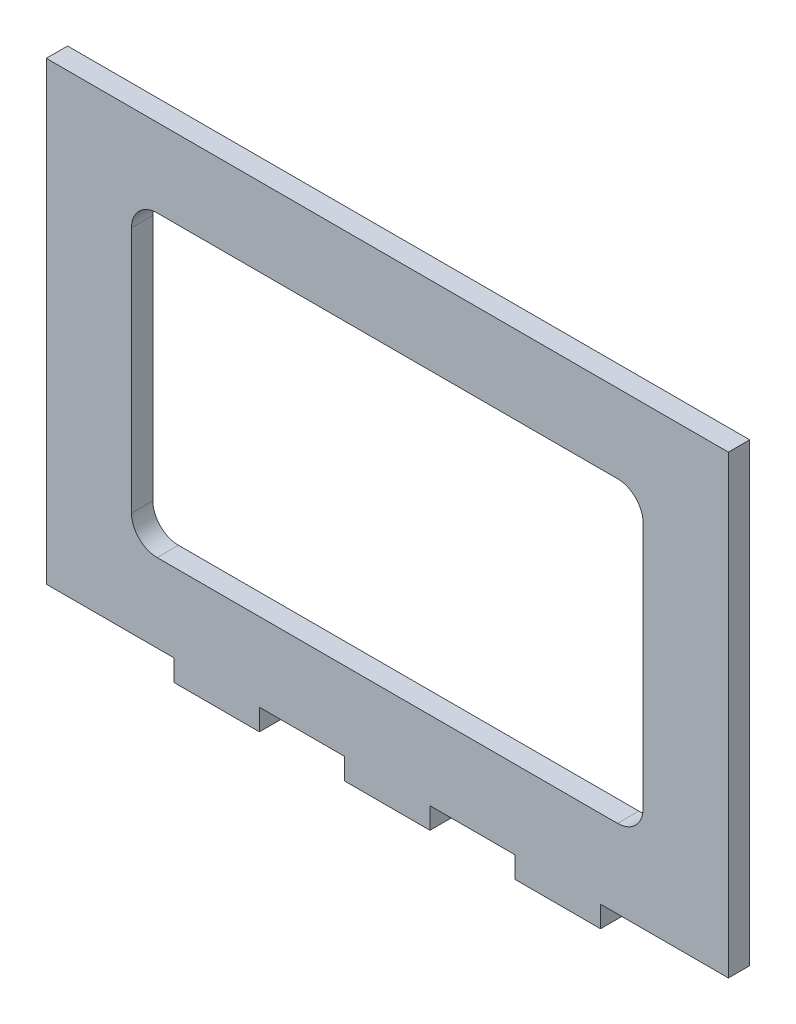
ISO-10303-21;
HEADER;
FILE_DESCRIPTION(('STEP AP214'),'2;1');
FILE_NAME('part.step','',(''),(''),'','','');
FILE_SCHEMA(('AUTOMOTIVE_DESIGN { 1 0 10303 214 1 1 1 1 }'));
ENDSEC;
DATA;
#1=APPLICATION_CONTEXT('core data for automotive mechanical design processes');
#2=APPLICATION_PROTOCOL_DEFINITION('international standard','automotive_design',2000,#1);
#3=PRODUCT_CONTEXT('',#1,'mechanical');
#4=PRODUCT('Part','Part','',(#3));
#5=PRODUCT_RELATED_PRODUCT_CATEGORY('part','',(#4));
#6=PRODUCT_DEFINITION_FORMATION('','',#4);
#7=PRODUCT_DEFINITION_CONTEXT('part definition',#1,'design');
#8=PRODUCT_DEFINITION('design','',#6,#7);
#9=PRODUCT_DEFINITION_SHAPE('','',#8);
#10=(LENGTH_UNIT() NAMED_UNIT(*) SI_UNIT(.MILLI.,.METRE.));
#11=(NAMED_UNIT(*) PLANE_ANGLE_UNIT() SI_UNIT($,.RADIAN.));
#12=(NAMED_UNIT(*) SI_UNIT($,.STERADIAN.) SOLID_ANGLE_UNIT());
#13=UNCERTAINTY_MEASURE_WITH_UNIT(LENGTH_MEASURE(1.E-05),#10,'distance_accuracy_value','');
#14=(GEOMETRIC_REPRESENTATION_CONTEXT(3) GLOBAL_UNCERTAINTY_ASSIGNED_CONTEXT((#13)) GLOBAL_UNIT_ASSIGNED_CONTEXT((#10,
#11,#12)) REPRESENTATION_CONTEXT('',''));
#15=CARTESIAN_POINT('',(0.,0.,0.));
#16=DIRECTION('',(0.,0.,1.));
#17=DIRECTION('',(1.,0.,0.));
#18=AXIS2_PLACEMENT_3D('',#15,#16,#17);
#19=CARTESIAN_POINT('',(0.,17.5,2.5));
#20=DIRECTION('',(0.,1.,0.));
#21=DIRECTION('',(0.,0.,1.));
#22=AXIS2_PLACEMENT_3D('',#19,#20,#21);
#23=PLANE('',#22);
#24=DIRECTION('',(1.,0.,0.));
#25=VECTOR('',#24,1.);
#26=CARTESIAN_POINT('',(0.,17.5,0.));
#27=LINE('',#26,#25);
#28=CARTESIAN_POINT('',(-27.,17.5,0.));
#29=VERTEX_POINT('',#28);
#30=CARTESIAN_POINT('',(27.,17.5,0.));
#31=VERTEX_POINT('',#30);
#32=EDGE_CURVE('E268',#29,#31,#27,.T.);
#33=ORIENTED_EDGE('',*,*,#32,.T.);
#34=DIRECTION('',(0.,0.,-1.));
#35=VECTOR('',#34,1.);
#36=CARTESIAN_POINT('',(27.,17.5,2.5));
#37=LINE('',#36,#35);
#38=CARTESIAN_POINT('',(27.,17.5,2.5));
#39=VERTEX_POINT('',#38);
#40=EDGE_CURVE('E11',#39,#31,#37,.T.);
#41=ORIENTED_EDGE('',*,*,#40,.F.);
#42=DIRECTION('',(1.,0.,0.));
#43=VECTOR('',#42,1.);
#44=CARTESIAN_POINT('',(0.,17.5,2.5));
#45=LINE('',#44,#43);
#46=CARTESIAN_POINT('',(-27.,17.5,2.5));
#47=VERTEX_POINT('',#46);
#48=EDGE_CURVE('E659',#47,#39,#45,.T.);
#49=ORIENTED_EDGE('',*,*,#48,.F.);
#50=DIRECTION('',(0.,0.,-1.));
#51=VECTOR('',#50,1.);
#52=CARTESIAN_POINT('',(-27.,17.5,2.5));
#53=LINE('',#52,#51);
#54=EDGE_CURVE('E287',#47,#29,#53,.T.);
#55=ORIENTED_EDGE('',*,*,#54,.T.);
#56=EDGE_LOOP('',(#33,#41,#49,#55));
#57=FACE_BOUND('',#56,.T.);
#58=ADVANCED_FACE('F35',(#57),#23,.F.);
#59=CARTESIAN_POINT('',(27.,14.5,2.5));
#60=DIRECTION('',(0.,0.,-1.));
#61=DIRECTION('',(-1.,0.,0.));
#62=AXIS2_PLACEMENT_3D('',#59,#60,#61);
#63=CYLINDRICAL_SURFACE('',#62,3.);
#64=CARTESIAN_POINT('',(27.,14.5,0.));
#65=DIRECTION('',(0.,0.,1.));
#66=DIRECTION('',(1.,0.,0.));
#67=AXIS2_PLACEMENT_3D('',#64,#65,#66);
#68=CIRCLE('',#67,3.);
#69=CARTESIAN_POINT('',(30.,14.5,0.));
#70=VERTEX_POINT('',#69);
#71=EDGE_CURVE('E271',#31,#70,#68,.F.);
#72=ORIENTED_EDGE('',*,*,#71,.T.);
#73=DIRECTION('',(0.,0.,-1.));
#74=VECTOR('',#73,1.);
#75=CARTESIAN_POINT('',(30.,14.5,2.5));
#76=LINE('',#75,#74);
#77=CARTESIAN_POINT('',(30.,14.5,2.5));
#78=VERTEX_POINT('',#77);
#79=EDGE_CURVE('E45',#78,#70,#76,.T.);
#80=ORIENTED_EDGE('',*,*,#79,.F.);
#81=CARTESIAN_POINT('',(27.,14.5,2.5));
#82=DIRECTION('',(0.,0.,1.));
#83=DIRECTION('',(1.,0.,0.));
#84=AXIS2_PLACEMENT_3D('',#81,#82,#83);
#85=CIRCLE('',#84,3.);
#86=EDGE_CURVE('E655',#39,#78,#85,.F.);
#87=ORIENTED_EDGE('',*,*,#86,.F.);
#88=ORIENTED_EDGE('',*,*,#40,.T.);
#89=EDGE_LOOP('',(#72,#80,#87,#88));
#90=FACE_BOUND('',#89,.T.);
#91=ADVANCED_FACE('F433',(#90),#63,.F.);
#92=CARTESIAN_POINT('',(30.,0.,2.5));
#93=DIRECTION('',(-1.,0.,0.));
#94=DIRECTION('',(0.,0.,1.));
#95=AXIS2_PLACEMENT_3D('',#92,#93,#94);
#96=PLANE('',#95);
#97=DIRECTION('',(0.,1.,0.));
#98=VECTOR('',#97,1.);
#99=CARTESIAN_POINT('',(30.,0.,0.));
#100=LINE('',#99,#98);
#101=CARTESIAN_POINT('',(30.,-14.5,0.));
#102=VERTEX_POINT('',#101);
#103=EDGE_CURVE('E274',#102,#70,#100,.T.);
#104=ORIENTED_EDGE('',*,*,#103,.F.);
#105=DIRECTION('',(0.,0.,-1.));
#106=VECTOR('',#105,1.);
#107=CARTESIAN_POINT('',(30.,-14.5,2.5));
#108=LINE('',#107,#106);
#109=CARTESIAN_POINT('',(30.,-14.5,2.5));
#110=VERTEX_POINT('',#109);
#111=EDGE_CURVE('E293',#110,#102,#108,.T.);
#112=ORIENTED_EDGE('',*,*,#111,.F.);
#113=DIRECTION('',(0.,1.,0.));
#114=VECTOR('',#113,1.);
#115=CARTESIAN_POINT('',(30.,0.,2.5));
#116=LINE('',#115,#114);
#117=EDGE_CURVE('E653',#110,#78,#116,.T.);
#118=ORIENTED_EDGE('',*,*,#117,.T.);
#119=ORIENTED_EDGE('',*,*,#79,.T.);
#120=EDGE_LOOP('',(#104,#112,#118,#119));
#121=FACE_BOUND('',#120,.T.);
#122=ADVANCED_FACE('F439',(#121),#96,.T.);
#123=CARTESIAN_POINT('',(27.,-14.5,2.5));
#124=DIRECTION('',(0.,0.,-1.));
#125=DIRECTION('',(-1.,0.,0.));
#126=AXIS2_PLACEMENT_3D('',#123,#124,#125);
#127=CYLINDRICAL_SURFACE('',#126,3.);
#128=CARTESIAN_POINT('',(27.,-14.5,0.));
#129=DIRECTION('',(0.,0.,1.));
#130=DIRECTION('',(1.,0.,0.));
#131=AXIS2_PLACEMENT_3D('',#128,#129,#130);
#132=CIRCLE('',#131,3.);
#133=CARTESIAN_POINT('',(27.,-17.5,0.));
#134=VERTEX_POINT('',#133);
#135=EDGE_CURVE('E277',#134,#102,#132,.T.);
#136=ORIENTED_EDGE('',*,*,#135,.F.);
#137=DIRECTION('',(0.,0.,-1.));
#138=VECTOR('',#137,1.);
#139=CARTESIAN_POINT('',(27.,-17.5,2.5));
#140=LINE('',#139,#138);
#141=CARTESIAN_POINT('',(27.,-17.5,2.5));
#142=VERTEX_POINT('',#141);
#143=EDGE_CURVE('E291',#142,#134,#140,.T.);
#144=ORIENTED_EDGE('',*,*,#143,.F.);
#145=CARTESIAN_POINT('',(27.,-14.5,2.5));
#146=DIRECTION('',(0.,0.,1.));
#147=DIRECTION('',(1.,0.,0.));
#148=AXIS2_PLACEMENT_3D('',#145,#146,#147);
#149=CIRCLE('',#148,3.);
#150=EDGE_CURVE('E652',#142,#110,#149,.T.);
#151=ORIENTED_EDGE('',*,*,#150,.T.);
#152=ORIENTED_EDGE('',*,*,#111,.T.);
#153=EDGE_LOOP('',(#136,#144,#151,#152));
#154=FACE_BOUND('',#153,.T.);
#155=ADVANCED_FACE('F612',(#154),#127,.F.);
#156=CARTESIAN_POINT('',(0.,-17.5,2.5));
#157=DIRECTION('',(0.,1.,0.));
#158=DIRECTION('',(0.,0.,1.));
#159=AXIS2_PLACEMENT_3D('',#156,#157,#158);
#160=PLANE('',#159);
#161=DIRECTION('',(1.,0.,0.));
#162=VECTOR('',#161,1.);
#163=CARTESIAN_POINT('',(0.,-17.5,0.));
#164=LINE('',#163,#162);
#165=CARTESIAN_POINT('',(-27.,-17.5,0.));
#166=VERTEX_POINT('',#165);
#167=EDGE_CURVE('E280',#166,#134,#164,.T.);
#168=ORIENTED_EDGE('',*,*,#167,.F.);
#169=DIRECTION('',(0.,0.,-1.));
#170=VECTOR('',#169,1.);
#171=CARTESIAN_POINT('',(-27.,-17.5,2.5));
#172=LINE('',#171,#170);
#173=CARTESIAN_POINT('',(-27.,-17.5,2.5));
#174=VERTEX_POINT('',#173);
#175=EDGE_CURVE('E222',#174,#166,#172,.T.);
#176=ORIENTED_EDGE('',*,*,#175,.F.);
#177=DIRECTION('',(1.,0.,0.));
#178=VECTOR('',#177,1.);
#179=CARTESIAN_POINT('',(0.,-17.5,2.5));
#180=LINE('',#179,#178);
#181=EDGE_CURVE('E215',#174,#142,#180,.T.);
#182=ORIENTED_EDGE('',*,*,#181,.T.);
#183=ORIENTED_EDGE('',*,*,#143,.T.);
#184=EDGE_LOOP('',(#168,#176,#182,#183));
#185=FACE_BOUND('',#184,.T.);
#186=ADVANCED_FACE('F603',(#185),#160,.T.);
#187=CARTESIAN_POINT('',(-27.,-14.5,2.5));
#188=DIRECTION('',(0.,0.,-1.));
#189=DIRECTION('',(-1.,0.,0.));
#190=AXIS2_PLACEMENT_3D('',#187,#188,#189);
#191=CYLINDRICAL_SURFACE('',#190,3.);
#192=CARTESIAN_POINT('',(-27.,-14.5,0.));
#193=DIRECTION('',(0.,0.,1.));
#194=DIRECTION('',(1.,0.,0.));
#195=AXIS2_PLACEMENT_3D('',#192,#193,#194);
#196=CIRCLE('',#195,3.);
#197=CARTESIAN_POINT('',(-30.,-14.5,0.));
#198=VERTEX_POINT('',#197);
#199=EDGE_CURVE('E221',#166,#198,#196,.F.);
#200=ORIENTED_EDGE('',*,*,#199,.T.);
#201=DIRECTION('',(0.,0.,-1.));
#202=VECTOR('',#201,1.);
#203=CARTESIAN_POINT('',(-30.,-14.5,2.5));
#204=LINE('',#203,#202);
#205=CARTESIAN_POINT('',(-30.,-14.5,2.5));
#206=VERTEX_POINT('',#205);
#207=EDGE_CURVE('E218',#206,#198,#204,.T.);
#208=ORIENTED_EDGE('',*,*,#207,.F.);
#209=CARTESIAN_POINT('',(-27.,-14.5,2.5));
#210=DIRECTION('',(0.,0.,1.));
#211=DIRECTION('',(1.,0.,0.));
#212=AXIS2_PLACEMENT_3D('',#209,#210,#211);
#213=CIRCLE('',#212,3.);
#214=EDGE_CURVE('E208',#174,#206,#213,.F.);
#215=ORIENTED_EDGE('',*,*,#214,.F.);
#216=ORIENTED_EDGE('',*,*,#175,.T.);
#217=EDGE_LOOP('',(#200,#208,#215,#216));
#218=FACE_BOUND('',#217,.T.);
#219=ADVANCED_FACE('F219',(#218),#191,.F.);
#220=CARTESIAN_POINT('',(-30.,0.,2.5));
#221=DIRECTION('',(-1.,0.,0.));
#222=DIRECTION('',(0.,0.,1.));
#223=AXIS2_PLACEMENT_3D('',#220,#221,#222);
#224=PLANE('',#223);
#225=DIRECTION('',(0.,1.,0.));
#226=VECTOR('',#225,1.);
#227=CARTESIAN_POINT('',(-30.,0.,0.));
#228=LINE('',#227,#226);
#229=CARTESIAN_POINT('',(-30.,14.5,0.));
#230=VERTEX_POINT('',#229);
#231=EDGE_CURVE('E131',#198,#230,#228,.T.);
#232=ORIENTED_EDGE('',*,*,#231,.T.);
#233=DIRECTION('',(0.,0.,-1.));
#234=VECTOR('',#233,1.);
#235=CARTESIAN_POINT('',(-30.,14.5,2.5));
#236=LINE('',#235,#234);
#237=CARTESIAN_POINT('',(-30.,14.5,2.5));
#238=VERTEX_POINT('',#237);
#239=EDGE_CURVE('E223',#238,#230,#236,.T.);
#240=ORIENTED_EDGE('',*,*,#239,.F.);
#241=DIRECTION('',(0.,1.,0.));
#242=VECTOR('',#241,1.);
#243=CARTESIAN_POINT('',(-30.,0.,2.5));
#244=LINE('',#243,#242);
#245=EDGE_CURVE('E212',#206,#238,#244,.T.);
#246=ORIENTED_EDGE('',*,*,#245,.F.);
#247=ORIENTED_EDGE('',*,*,#207,.T.);
#248=EDGE_LOOP('',(#232,#240,#246,#247));
#249=FACE_BOUND('',#248,.T.);
#250=ADVANCED_FACE('F225',(#249),#224,.F.);
#251=CARTESIAN_POINT('',(0.,-26.705,2.5));
#252=DIRECTION('',(0.,-1.,0.));
#253=DIRECTION('',(0.,0.,-1.));
#254=AXIS2_PLACEMENT_3D('',#251,#252,#253);
#255=PLANE('',#254);
#256=DIRECTION('',(-1.,0.,0.));
#257=VECTOR('',#256,1.);
#258=CARTESIAN_POINT('',(0.,-26.705,0.));
#259=LINE('',#258,#257);
#260=CARTESIAN_POINT('',(40.,-26.705,0.));
#261=VERTEX_POINT('',#260);
#262=CARTESIAN_POINT('',(25.,-26.705,0.));
#263=VERTEX_POINT('',#262);
#264=EDGE_CURVE('E231',#261,#263,#259,.T.);
#265=ORIENTED_EDGE('',*,*,#264,.F.);
#266=DIRECTION('',(0.,0.,-1.));
#267=VECTOR('',#266,1.);
#268=CARTESIAN_POINT('',(40.,-26.705,2.5));
#269=LINE('',#268,#267);
#270=CARTESIAN_POINT('',(40.,-26.705,2.5));
#271=VERTEX_POINT('',#270);
#272=EDGE_CURVE('E39',#271,#261,#269,.T.);
#273=ORIENTED_EDGE('',*,*,#272,.F.);
#274=DIRECTION('',(-1.,0.,0.));
#275=VECTOR('',#274,1.);
#276=CARTESIAN_POINT('',(0.,-26.705,2.5));
#277=LINE('',#276,#275);
#278=CARTESIAN_POINT('',(25.,-26.705,2.5));
#279=VERTEX_POINT('',#278);
#280=EDGE_CURVE('E286',#271,#279,#277,.T.);
#281=ORIENTED_EDGE('',*,*,#280,.T.);
#282=DIRECTION('',(0.,0.,-1.));
#283=VECTOR('',#282,1.);
#284=CARTESIAN_POINT('',(25.,-26.705,2.5));
#285=LINE('',#284,#283);
#286=EDGE_CURVE('E227',#279,#263,#285,.T.);
#287=ORIENTED_EDGE('',*,*,#286,.T.);
#288=EDGE_LOOP('',(#265,#273,#281,#287));
#289=FACE_BOUND('',#288,.T.);
#290=ADVANCED_FACE('F37',(#289),#255,.T.);
#291=CARTESIAN_POINT('',(40.,0.,2.5));
#292=DIRECTION('',(-1.,0.,0.));
#293=DIRECTION('',(0.,0.,1.));
#294=AXIS2_PLACEMENT_3D('',#291,#292,#293);
#295=PLANE('',#294);
#296=DIRECTION('',(0.,1.,0.));
#297=VECTOR('',#296,1.);
#298=CARTESIAN_POINT('',(40.,0.,0.));
#299=LINE('',#298,#297);
#300=CARTESIAN_POINT('',(40.,26.705,0.));
#301=VERTEX_POINT('',#300);
#302=EDGE_CURVE('E234',#261,#301,#299,.T.);
#303=ORIENTED_EDGE('',*,*,#302,.T.);
#304=DIRECTION('',(0.,0.,-1.));
#305=VECTOR('',#304,1.);
#306=CARTESIAN_POINT('',(40.,26.705,2.5));
#307=LINE('',#306,#305);
#308=CARTESIAN_POINT('',(40.,26.705,2.5));
#309=VERTEX_POINT('',#308);
#310=EDGE_CURVE('E333',#309,#301,#307,.T.);
#311=ORIENTED_EDGE('',*,*,#310,.F.);
#312=DIRECTION('',(0.,1.,0.));
#313=VECTOR('',#312,1.);
#314=CARTESIAN_POINT('',(40.,0.,2.5));
#315=LINE('',#314,#313);
#316=EDGE_CURVE('E341',#271,#309,#315,.T.);
#317=ORIENTED_EDGE('',*,*,#316,.F.);
#318=ORIENTED_EDGE('',*,*,#272,.T.);
#319=EDGE_LOOP('',(#303,#311,#317,#318));
#320=FACE_BOUND('',#319,.T.);
#321=ADVANCED_FACE('F340',(#320),#295,.F.);
#322=CARTESIAN_POINT('',(0.,26.705,2.5));
#323=DIRECTION('',(0.,1.,0.));
#324=DIRECTION('',(0.,0.,1.));
#325=AXIS2_PLACEMENT_3D('',#322,#323,#324);
#326=PLANE('',#325);
#327=DIRECTION('',(1.,0.,0.));
#328=VECTOR('',#327,1.);
#329=CARTESIAN_POINT('',(0.,26.705,0.));
#330=LINE('',#329,#328);
#331=CARTESIAN_POINT('',(-40.,26.705,0.));
#332=VERTEX_POINT('',#331);
#333=EDGE_CURVE('E237',#332,#301,#330,.T.);
#334=ORIENTED_EDGE('',*,*,#333,.F.);
#335=DIRECTION('',(0.,0.,-1.));
#336=VECTOR('',#335,1.);
#337=CARTESIAN_POINT('',(-40.,26.705,2.5));
#338=LINE('',#337,#336);
#339=CARTESIAN_POINT('',(-40.,26.705,2.5));
#340=VERTEX_POINT('',#339);
#341=EDGE_CURVE('E332',#340,#332,#338,.T.);
#342=ORIENTED_EDGE('',*,*,#341,.F.);
#343=DIRECTION('',(1.,0.,0.));
#344=VECTOR('',#343,1.);
#345=CARTESIAN_POINT('',(0.,26.705,2.5));
#346=LINE('',#345,#344);
#347=EDGE_CURVE('E675',#340,#309,#346,.T.);
#348=ORIENTED_EDGE('',*,*,#347,.T.);
#349=ORIENTED_EDGE('',*,*,#310,.T.);
#350=EDGE_LOOP('',(#334,#342,#348,#349));
#351=FACE_BOUND('',#350,.T.);
#352=ADVANCED_FACE('F424',(#351),#326,.T.);
#353=CARTESIAN_POINT('',(-40.,0.,2.5));
#354=DIRECTION('',(-1.,0.,0.));
#355=DIRECTION('',(0.,0.,1.));
#356=AXIS2_PLACEMENT_3D('',#353,#354,#355);
#357=PLANE('',#356);
#358=DIRECTION('',(0.,1.,0.));
#359=VECTOR('',#358,1.);
#360=CARTESIAN_POINT('',(-40.,0.,0.));
#361=LINE('',#360,#359);
#362=CARTESIAN_POINT('',(-40.,-26.705,0.));
#363=VERTEX_POINT('',#362);
#364=EDGE_CURVE('E240',#363,#332,#361,.T.);
#365=ORIENTED_EDGE('',*,*,#364,.F.);
#366=DIRECTION('',(0.,0.,-1.));
#367=VECTOR('',#366,1.);
#368=CARTESIAN_POINT('',(-40.,-26.705,2.5));
#369=LINE('',#368,#367);
#370=CARTESIAN_POINT('',(-40.,-26.705,2.5));
#371=VERTEX_POINT('',#370);
#372=EDGE_CURVE('E330',#371,#363,#369,.T.);
#373=ORIENTED_EDGE('',*,*,#372,.F.);
#374=DIRECTION('',(0.,1.,0.));
#375=VECTOR('',#374,1.);
#376=CARTESIAN_POINT('',(-40.,0.,2.5));
#377=LINE('',#376,#375);
#378=EDGE_CURVE('E422',#371,#340,#377,.T.);
#379=ORIENTED_EDGE('',*,*,#378,.T.);
#380=ORIENTED_EDGE('',*,*,#341,.T.);
#381=EDGE_LOOP('',(#365,#373,#379,#380));
#382=FACE_BOUND('',#381,.T.);
#383=ADVANCED_FACE('F421',(#382),#357,.T.);
#384=CARTESIAN_POINT('',(0.,-26.705,2.5));
#385=DIRECTION('',(0.,1.,0.));
#386=DIRECTION('',(0.,0.,1.));
#387=AXIS2_PLACEMENT_3D('',#384,#385,#386);
#388=PLANE('',#387);
#389=DIRECTION('',(1.,0.,0.));
#390=VECTOR('',#389,1.);
#391=CARTESIAN_POINT('',(0.,-26.705,0.));
#392=LINE('',#391,#390);
#393=CARTESIAN_POINT('',(-25.,-26.705,0.));
#394=VERTEX_POINT('',#393);
#395=EDGE_CURVE('E243',#363,#394,#392,.T.);
#396=ORIENTED_EDGE('',*,*,#395,.T.);
#397=DIRECTION('',(0.,0.,-1.));
#398=VECTOR('',#397,1.);
#399=CARTESIAN_POINT('',(-25.,-26.705,2.5));
#400=LINE('',#399,#398);
#401=CARTESIAN_POINT('',(-25.,-26.705,2.5));
#402=VERTEX_POINT('',#401);
#403=EDGE_CURVE('E327',#402,#394,#400,.T.);
#404=ORIENTED_EDGE('',*,*,#403,.F.);
#405=DIRECTION('',(1.,0.,0.));
#406=VECTOR('',#405,1.);
#407=CARTESIAN_POINT('',(0.,-26.705,2.5));
#408=LINE('',#407,#406);
#409=EDGE_CURVE('E417',#371,#402,#408,.T.);
#410=ORIENTED_EDGE('',*,*,#409,.F.);
#411=ORIENTED_EDGE('',*,*,#372,.T.);
#412=EDGE_LOOP('',(#396,#404,#410,#411));
#413=FACE_BOUND('',#412,.T.);
#414=ADVANCED_FACE('F416',(#413),#388,.F.);
#415=CARTESIAN_POINT('',(-25.,0.,2.5));
#416=DIRECTION('',(1.,0.,0.));
#417=DIRECTION('',(0.,0.,-1.));
#418=AXIS2_PLACEMENT_3D('',#415,#416,#417);
#419=PLANE('',#418);
#420=DIRECTION('',(0.,-1.,0.));
#421=VECTOR('',#420,1.);
#422=CARTESIAN_POINT('',(-25.,0.,0.));
#423=LINE('',#422,#421);
#424=CARTESIAN_POINT('',(-25.,-29.205,0.));
#425=VERTEX_POINT('',#424);
#426=EDGE_CURVE('E245',#394,#425,#423,.T.);
#427=ORIENTED_EDGE('',*,*,#426,.T.);
#428=DIRECTION('',(0.,0.,-1.));
#429=VECTOR('',#428,1.);
#430=CARTESIAN_POINT('',(-25.,-29.205,2.5));
#431=LINE('',#430,#429);
#432=CARTESIAN_POINT('',(-25.,-29.205,2.5));
#433=VERTEX_POINT('',#432);
#434=EDGE_CURVE('E324',#433,#425,#431,.T.);
#435=ORIENTED_EDGE('',*,*,#434,.F.);
#436=DIRECTION('',(0.,-1.,0.));
#437=VECTOR('',#436,1.);
#438=CARTESIAN_POINT('',(-25.,0.,2.5));
#439=LINE('',#438,#437);
#440=EDGE_CURVE('E413',#402,#433,#439,.T.);
#441=ORIENTED_EDGE('',*,*,#440,.F.);
#442=ORIENTED_EDGE('',*,*,#403,.T.);
#443=EDGE_LOOP('',(#427,#435,#441,#442));
#444=FACE_BOUND('',#443,.T.);
#445=ADVANCED_FACE('F410',(#444),#419,.F.);
#446=CARTESIAN_POINT('',(0.,-29.205,2.5));
#447=DIRECTION('',(0.,1.,0.));
#448=DIRECTION('',(0.,0.,1.));
#449=AXIS2_PLACEMENT_3D('',#446,#447,#448);
#450=PLANE('',#449);
#451=DIRECTION('',(1.,0.,0.));
#452=VECTOR('',#451,1.);
#453=CARTESIAN_POINT('',(0.,-29.205,0.));
#454=LINE('',#453,#452);
#455=CARTESIAN_POINT('',(-15.,-29.205,0.));
#456=VERTEX_POINT('',#455);
#457=EDGE_CURVE('E247',#425,#456,#454,.T.);
#458=ORIENTED_EDGE('',*,*,#457,.T.);
#459=DIRECTION('',(0.,0.,-1.));
#460=VECTOR('',#459,1.);
#461=CARTESIAN_POINT('',(-15.,-29.205,2.5));
#462=LINE('',#461,#460);
#463=CARTESIAN_POINT('',(-15.,-29.205,2.5));
#464=VERTEX_POINT('',#463);
#465=EDGE_CURVE('E321',#464,#456,#462,.T.);
#466=ORIENTED_EDGE('',*,*,#465,.F.);
#467=DIRECTION('',(1.,0.,0.));
#468=VECTOR('',#467,1.);
#469=CARTESIAN_POINT('',(0.,-29.205,2.5));
#470=LINE('',#469,#468);
#471=EDGE_CURVE('E404',#433,#464,#470,.T.);
#472=ORIENTED_EDGE('',*,*,#471,.F.);
#473=ORIENTED_EDGE('',*,*,#434,.T.);
#474=EDGE_LOOP('',(#458,#466,#472,#473));
#475=FACE_BOUND('',#474,.T.);
#476=ADVANCED_FACE('F403',(#475),#450,.F.);
#477=CARTESIAN_POINT('',(-15.,0.,2.5));
#478=DIRECTION('',(-1.,0.,0.));
#479=DIRECTION('',(0.,-1.,0.));
#480=AXIS2_PLACEMENT_3D('',#477,#478,#479);
#481=PLANE('',#480);
#482=DIRECTION('',(0.,1.,0.));
#483=VECTOR('',#482,1.);
#484=CARTESIAN_POINT('',(-15.,0.,0.));
#485=LINE('',#484,#483);
#486=CARTESIAN_POINT('',(-15.,-26.705,0.));
#487=VERTEX_POINT('',#486);
#488=EDGE_CURVE('E249',#456,#487,#485,.T.);
#489=ORIENTED_EDGE('',*,*,#488,.T.);
#490=DIRECTION('',(0.,0.,-1.));
#491=VECTOR('',#490,1.);
#492=CARTESIAN_POINT('',(-15.,-26.705,2.5));
#493=LINE('',#492,#491);
#494=CARTESIAN_POINT('',(-15.,-26.705,2.5));
#495=VERTEX_POINT('',#494);
#496=EDGE_CURVE('E318',#495,#487,#493,.T.);
#497=ORIENTED_EDGE('',*,*,#496,.F.);
#498=DIRECTION('',(0.,1.,0.));
#499=VECTOR('',#498,1.);
#500=CARTESIAN_POINT('',(-15.,0.,2.5));
#501=LINE('',#500,#499);
#502=EDGE_CURVE('E399',#464,#495,#501,.T.);
#503=ORIENTED_EDGE('',*,*,#502,.F.);
#504=ORIENTED_EDGE('',*,*,#465,.T.);
#505=EDGE_LOOP('',(#489,#497,#503,#504));
#506=FACE_BOUND('',#505,.T.);
#507=ADVANCED_FACE('F398',(#506),#481,.F.);
#508=CARTESIAN_POINT('',(0.,-26.705,2.5));
#509=DIRECTION('',(0.,1.,0.));
#510=DIRECTION('',(0.,0.,1.));
#511=AXIS2_PLACEMENT_3D('',#508,#509,#510);
#512=PLANE('',#511);
#513=DIRECTION('',(1.,0.,0.));
#514=VECTOR('',#513,1.);
#515=CARTESIAN_POINT('',(0.,-26.705,0.));
#516=LINE('',#515,#514);
#517=CARTESIAN_POINT('',(-5.00000000000001,-26.705,0.));
#518=VERTEX_POINT('',#517);
#519=EDGE_CURVE('E251',#487,#518,#516,.T.);
#520=ORIENTED_EDGE('',*,*,#519,.T.);
#521=DIRECTION('',(0.,0.,-1.));
#522=VECTOR('',#521,1.);
#523=CARTESIAN_POINT('',(-5.00000000000001,-26.705,2.5));
#524=LINE('',#523,#522);
#525=CARTESIAN_POINT('',(-5.00000000000001,-26.705,2.5));
#526=VERTEX_POINT('',#525);
#527=EDGE_CURVE('E315',#526,#518,#524,.T.);
#528=ORIENTED_EDGE('',*,*,#527,.F.);
#529=DIRECTION('',(1.,0.,0.));
#530=VECTOR('',#529,1.);
#531=CARTESIAN_POINT('',(0.,-26.705,2.5));
#532=LINE('',#531,#530);
#533=EDGE_CURVE('E395',#495,#526,#532,.T.);
#534=ORIENTED_EDGE('',*,*,#533,.F.);
#535=ORIENTED_EDGE('',*,*,#496,.T.);
#536=EDGE_LOOP('',(#520,#528,#534,#535));
#537=FACE_BOUND('',#536,.T.);
#538=ADVANCED_FACE('F392',(#537),#512,.F.);
#539=CARTESIAN_POINT('',(-5.00000000000001,0.,2.5));
#540=DIRECTION('',(1.,0.,0.));
#541=DIRECTION('',(0.,0.,-1.));
#542=AXIS2_PLACEMENT_3D('',#539,#540,#541);
#543=PLANE('',#542);
#544=DIRECTION('',(0.,-1.,0.));
#545=VECTOR('',#544,1.);
#546=CARTESIAN_POINT('',(-5.00000000000001,0.,0.));
#547=LINE('',#546,#545);
#548=CARTESIAN_POINT('',(-5.00000000000001,-29.205,0.));
#549=VERTEX_POINT('',#548);
#550=EDGE_CURVE('E253',#518,#549,#547,.T.);
#551=ORIENTED_EDGE('',*,*,#550,.T.);
#552=DIRECTION('',(0.,0.,-1.));
#553=VECTOR('',#552,1.);
#554=CARTESIAN_POINT('',(-5.00000000000001,-29.205,2.5));
#555=LINE('',#554,#553);
#556=CARTESIAN_POINT('',(-5.00000000000001,-29.205,2.5));
#557=VERTEX_POINT('',#556);
#558=EDGE_CURVE('E312',#557,#549,#555,.T.);
#559=ORIENTED_EDGE('',*,*,#558,.F.);
#560=DIRECTION('',(0.,-1.,0.));
#561=VECTOR('',#560,1.);
#562=CARTESIAN_POINT('',(-5.00000000000001,0.,2.5));
#563=LINE('',#562,#561);
#564=EDGE_CURVE('E386',#526,#557,#563,.T.);
#565=ORIENTED_EDGE('',*,*,#564,.F.);
#566=ORIENTED_EDGE('',*,*,#527,.T.);
#567=EDGE_LOOP('',(#551,#559,#565,#566));
#568=FACE_BOUND('',#567,.T.);
#569=ADVANCED_FACE('F385',(#568),#543,.F.);
#570=CARTESIAN_POINT('',(0.,-29.205,2.5));
#571=DIRECTION('',(0.,1.,0.));
#572=DIRECTION('',(0.,0.,1.));
#573=AXIS2_PLACEMENT_3D('',#570,#571,#572);
#574=PLANE('',#573);
#575=DIRECTION('',(1.,0.,0.));
#576=VECTOR('',#575,1.);
#577=CARTESIAN_POINT('',(0.,-29.205,0.));
#578=LINE('',#577,#576);
#579=CARTESIAN_POINT('',(4.99999999999999,-29.205,0.));
#580=VERTEX_POINT('',#579);
#581=EDGE_CURVE('E255',#549,#580,#578,.T.);
#582=ORIENTED_EDGE('',*,*,#581,.T.);
#583=DIRECTION('',(0.,0.,-1.));
#584=VECTOR('',#583,1.);
#585=CARTESIAN_POINT('',(4.99999999999999,-29.205,2.5));
#586=LINE('',#585,#584);
#587=CARTESIAN_POINT('',(4.99999999999999,-29.205,2.5));
#588=VERTEX_POINT('',#587);
#589=EDGE_CURVE('E309',#588,#580,#586,.T.);
#590=ORIENTED_EDGE('',*,*,#589,.F.);
#591=DIRECTION('',(1.,0.,0.));
#592=VECTOR('',#591,1.);
#593=CARTESIAN_POINT('',(0.,-29.205,2.5));
#594=LINE('',#593,#592);
#595=EDGE_CURVE('E381',#557,#588,#594,.T.);
#596=ORIENTED_EDGE('',*,*,#595,.F.);
#597=ORIENTED_EDGE('',*,*,#558,.T.);
#598=EDGE_LOOP('',(#582,#590,#596,#597));
#599=FACE_BOUND('',#598,.T.);
#600=ADVANCED_FACE('F380',(#599),#574,.F.);
#601=CARTESIAN_POINT('',(5.00000000000001,0.,2.5));
#602=DIRECTION('',(-1.,0.,0.));
#603=DIRECTION('',(0.,-1.,0.));
#604=AXIS2_PLACEMENT_3D('',#601,#602,#603);
#605=PLANE('',#604);
#606=DIRECTION('',(0.,1.,0.));
#607=VECTOR('',#606,1.);
#608=CARTESIAN_POINT('',(5.00000000000001,0.,0.));
#609=LINE('',#608,#607);
#610=CARTESIAN_POINT('',(4.99999999999999,-26.705,0.));
#611=VERTEX_POINT('',#610);
#612=EDGE_CURVE('E257',#580,#611,#609,.T.);
#613=ORIENTED_EDGE('',*,*,#612,.T.);
#614=DIRECTION('',(0.,0.,-1.));
#615=VECTOR('',#614,1.);
#616=CARTESIAN_POINT('',(4.99999999999999,-26.705,2.5));
#617=LINE('',#616,#615);
#618=CARTESIAN_POINT('',(4.99999999999999,-26.705,2.5));
#619=VERTEX_POINT('',#618);
#620=EDGE_CURVE('E306',#619,#611,#617,.T.);
#621=ORIENTED_EDGE('',*,*,#620,.F.);
#622=DIRECTION('',(0.,1.,0.));
#623=VECTOR('',#622,1.);
#624=CARTESIAN_POINT('',(5.00000000000001,0.,2.5));
#625=LINE('',#624,#623);
#626=EDGE_CURVE('E377',#588,#619,#625,.T.);
#627=ORIENTED_EDGE('',*,*,#626,.F.);
#628=ORIENTED_EDGE('',*,*,#589,.T.);
#629=EDGE_LOOP('',(#613,#621,#627,#628));
#630=FACE_BOUND('',#629,.T.);
#631=ADVANCED_FACE('F374',(#630),#605,.F.);
#632=CARTESIAN_POINT('',(0.,-26.705,2.5));
#633=DIRECTION('',(0.,1.,0.));
#634=DIRECTION('',(0.,0.,1.));
#635=AXIS2_PLACEMENT_3D('',#632,#633,#634);
#636=PLANE('',#635);
#637=DIRECTION('',(1.,0.,0.));
#638=VECTOR('',#637,1.);
#639=CARTESIAN_POINT('',(0.,-26.705,0.));
#640=LINE('',#639,#638);
#641=CARTESIAN_POINT('',(15.,-26.705,0.));
#642=VERTEX_POINT('',#641);
#643=EDGE_CURVE('E259',#611,#642,#640,.T.);
#644=ORIENTED_EDGE('',*,*,#643,.T.);
#645=DIRECTION('',(0.,0.,-1.));
#646=VECTOR('',#645,1.);
#647=CARTESIAN_POINT('',(15.,-26.705,2.5));
#648=LINE('',#647,#646);
#649=CARTESIAN_POINT('',(15.,-26.705,2.5));
#650=VERTEX_POINT('',#649);
#651=EDGE_CURVE('E303',#650,#642,#648,.T.);
#652=ORIENTED_EDGE('',*,*,#651,.F.);
#653=DIRECTION('',(1.,0.,0.));
#654=VECTOR('',#653,1.);
#655=CARTESIAN_POINT('',(0.,-26.705,2.5));
#656=LINE('',#655,#654);
#657=EDGE_CURVE('E368',#619,#650,#656,.T.);
#658=ORIENTED_EDGE('',*,*,#657,.F.);
#659=ORIENTED_EDGE('',*,*,#620,.T.);
#660=EDGE_LOOP('',(#644,#652,#658,#659));
#661=FACE_BOUND('',#660,.T.);
#662=ADVANCED_FACE('F367',(#661),#636,.F.);
#663=CARTESIAN_POINT('',(15.,0.,2.5));
#664=DIRECTION('',(1.,0.,0.));
#665=DIRECTION('',(0.,0.,-1.));
#666=AXIS2_PLACEMENT_3D('',#663,#664,#665);
#667=PLANE('',#666);
#668=DIRECTION('',(0.,-1.,0.));
#669=VECTOR('',#668,1.);
#670=CARTESIAN_POINT('',(15.,0.,0.));
#671=LINE('',#670,#669);
#672=CARTESIAN_POINT('',(15.,-29.205,0.));
#673=VERTEX_POINT('',#672);
#674=EDGE_CURVE('E261',#642,#673,#671,.T.);
#675=ORIENTED_EDGE('',*,*,#674,.T.);
#676=DIRECTION('',(0.,0.,-1.));
#677=VECTOR('',#676,1.);
#678=CARTESIAN_POINT('',(15.,-29.205,2.5));
#679=LINE('',#678,#677);
#680=CARTESIAN_POINT('',(15.,-29.205,2.5));
#681=VERTEX_POINT('',#680);
#682=EDGE_CURVE('E300',#681,#673,#679,.T.);
#683=ORIENTED_EDGE('',*,*,#682,.F.);
#684=DIRECTION('',(0.,-1.,0.));
#685=VECTOR('',#684,1.);
#686=CARTESIAN_POINT('',(15.,0.,2.5));
#687=LINE('',#686,#685);
#688=EDGE_CURVE('E363',#650,#681,#687,.T.);
#689=ORIENTED_EDGE('',*,*,#688,.F.);
#690=ORIENTED_EDGE('',*,*,#651,.T.);
#691=EDGE_LOOP('',(#675,#683,#689,#690));
#692=FACE_BOUND('',#691,.T.);
#693=ADVANCED_FACE('F362',(#692),#667,.F.);
#694=CARTESIAN_POINT('',(0.,-29.205,2.5));
#695=DIRECTION('',(0.,1.,0.));
#696=DIRECTION('',(0.,0.,1.));
#697=AXIS2_PLACEMENT_3D('',#694,#695,#696);
#698=PLANE('',#697);
#699=DIRECTION('',(1.,0.,0.));
#700=VECTOR('',#699,1.);
#701=CARTESIAN_POINT('',(0.,-29.205,0.));
#702=LINE('',#701,#700);
#703=CARTESIAN_POINT('',(25.,-29.205,0.));
#704=VERTEX_POINT('',#703);
#705=EDGE_CURVE('E263',#673,#704,#702,.T.);
#706=ORIENTED_EDGE('',*,*,#705,.T.);
#707=DIRECTION('',(0.,0.,-1.));
#708=VECTOR('',#707,1.);
#709=CARTESIAN_POINT('',(25.,-29.205,2.5));
#710=LINE('',#709,#708);
#711=CARTESIAN_POINT('',(25.,-29.205,2.5));
#712=VERTEX_POINT('',#711);
#713=EDGE_CURVE('E297',#712,#704,#710,.T.);
#714=ORIENTED_EDGE('',*,*,#713,.F.);
#715=DIRECTION('',(1.,0.,0.));
#716=VECTOR('',#715,1.);
#717=CARTESIAN_POINT('',(0.,-29.205,2.5));
#718=LINE('',#717,#716);
#719=EDGE_CURVE('E359',#681,#712,#718,.T.);
#720=ORIENTED_EDGE('',*,*,#719,.F.);
#721=ORIENTED_EDGE('',*,*,#682,.T.);
#722=EDGE_LOOP('',(#706,#714,#720,#721));
#723=FACE_BOUND('',#722,.T.);
#724=ADVANCED_FACE('F356',(#723),#698,.F.);
#725=CARTESIAN_POINT('',(25.,0.,2.5));
#726=DIRECTION('',(-1.,0.,0.));
#727=DIRECTION('',(0.,0.,1.));
#728=AXIS2_PLACEMENT_3D('',#725,#726,#727);
#729=PLANE('',#728);
#730=DIRECTION('',(0.,1.,0.));
#731=VECTOR('',#730,1.);
#732=CARTESIAN_POINT('',(25.,0.,0.));
#733=LINE('',#732,#731);
#734=EDGE_CURVE('E265',#704,#263,#733,.T.);
#735=ORIENTED_EDGE('',*,*,#734,.T.);
#736=ORIENTED_EDGE('',*,*,#286,.F.);
#737=DIRECTION('',(0.,1.,0.));
#738=VECTOR('',#737,1.);
#739=CARTESIAN_POINT('',(25.,0.,2.5));
#740=LINE('',#739,#738);
#741=EDGE_CURVE('E661',#712,#279,#740,.T.);
#742=ORIENTED_EDGE('',*,*,#741,.F.);
#743=ORIENTED_EDGE('',*,*,#713,.T.);
#744=EDGE_LOOP('',(#735,#736,#742,#743));
#745=FACE_BOUND('',#744,.T.);
#746=ADVANCED_FACE('F350',(#745),#729,.F.);
#747=CARTESIAN_POINT('',(-27.,14.5,2.5));
#748=DIRECTION('',(0.,0.,-1.));
#749=DIRECTION('',(-1.,0.,0.));
#750=AXIS2_PLACEMENT_3D('',#747,#748,#749);
#751=CYLINDRICAL_SURFACE('',#750,3.);
#752=CARTESIAN_POINT('',(-27.,14.5,0.));
#753=DIRECTION('',(0.,0.,1.));
#754=DIRECTION('',(1.,0.,0.));
#755=AXIS2_PLACEMENT_3D('',#752,#753,#754);
#756=CIRCLE('',#755,3.);
#757=EDGE_CURVE('E137',#230,#29,#756,.F.);
#758=ORIENTED_EDGE('',*,*,#757,.T.);
#759=ORIENTED_EDGE('',*,*,#54,.F.);
#760=CARTESIAN_POINT('',(-27.,14.5,2.5));
#761=DIRECTION('',(0.,0.,1.));
#762=DIRECTION('',(1.,0.,0.));
#763=AXIS2_PLACEMENT_3D('',#760,#761,#762);
#764=CIRCLE('',#763,3.);
#765=EDGE_CURVE('E54',#238,#47,#764,.F.);
#766=ORIENTED_EDGE('',*,*,#765,.F.);
#767=ORIENTED_EDGE('',*,*,#239,.T.);
#768=EDGE_LOOP('',(#758,#759,#766,#767));
#769=FACE_BOUND('',#768,.T.);
#770=ADVANCED_FACE('F446',(#769),#751,.F.);
#771=CARTESIAN_POINT('',(0.,0.,2.5));
#772=DIRECTION('',(0.,0.,1.));
#773=DIRECTION('',(1.,0.,0.));
#774=AXIS2_PLACEMENT_3D('',#771,#772,#773);
#775=PLANE('',#774);
#776=ORIENTED_EDGE('',*,*,#280,.F.);
#777=ORIENTED_EDGE('',*,*,#316,.T.);
#778=ORIENTED_EDGE('',*,*,#347,.F.);
#779=ORIENTED_EDGE('',*,*,#378,.F.);
#780=ORIENTED_EDGE('',*,*,#409,.T.);
#781=ORIENTED_EDGE('',*,*,#440,.T.);
#782=ORIENTED_EDGE('',*,*,#471,.T.);
#783=ORIENTED_EDGE('',*,*,#502,.T.);
#784=ORIENTED_EDGE('',*,*,#533,.T.);
#785=ORIENTED_EDGE('',*,*,#564,.T.);
#786=ORIENTED_EDGE('',*,*,#595,.T.);
#787=ORIENTED_EDGE('',*,*,#626,.T.);
#788=ORIENTED_EDGE('',*,*,#657,.T.);
#789=ORIENTED_EDGE('',*,*,#688,.T.);
#790=ORIENTED_EDGE('',*,*,#719,.T.);
#791=ORIENTED_EDGE('',*,*,#741,.T.);
#792=EDGE_LOOP('',(#776,#777,#778,#779,#780,#781,#782,#783,#784,#785,#786,#787,#788,#789,#790,#791));
#793=FACE_BOUND('',#792,.T.);
#794=ORIENTED_EDGE('',*,*,#48,.T.);
#795=ORIENTED_EDGE('',*,*,#86,.T.);
#796=ORIENTED_EDGE('',*,*,#117,.F.);
#797=ORIENTED_EDGE('',*,*,#150,.F.);
#798=ORIENTED_EDGE('',*,*,#181,.F.);
#799=ORIENTED_EDGE('',*,*,#214,.T.);
#800=ORIENTED_EDGE('',*,*,#245,.T.);
#801=ORIENTED_EDGE('',*,*,#765,.T.);
#802=EDGE_LOOP('',(#794,#795,#796,#797,#798,#799,#800,#801));
#803=FACE_BOUND('',#802,.T.);
#804=ADVANCED_FACE('F210',(#793,#803),#775,.T.);
#805=CARTESIAN_POINT('',(0.,0.,0.));
#806=DIRECTION('',(0.,0.,1.));
#807=DIRECTION('',(1.,0.,0.));
#808=AXIS2_PLACEMENT_3D('',#805,#806,#807);
#809=PLANE('',#808);
#810=ORIENTED_EDGE('',*,*,#264,.T.);
#811=ORIENTED_EDGE('',*,*,#734,.F.);
#812=ORIENTED_EDGE('',*,*,#705,.F.);
#813=ORIENTED_EDGE('',*,*,#674,.F.);
#814=ORIENTED_EDGE('',*,*,#643,.F.);
#815=ORIENTED_EDGE('',*,*,#612,.F.);
#816=ORIENTED_EDGE('',*,*,#581,.F.);
#817=ORIENTED_EDGE('',*,*,#550,.F.);
#818=ORIENTED_EDGE('',*,*,#519,.F.);
#819=ORIENTED_EDGE('',*,*,#488,.F.);
#820=ORIENTED_EDGE('',*,*,#457,.F.);
#821=ORIENTED_EDGE('',*,*,#426,.F.);
#822=ORIENTED_EDGE('',*,*,#395,.F.);
#823=ORIENTED_EDGE('',*,*,#364,.T.);
#824=ORIENTED_EDGE('',*,*,#333,.T.);
#825=ORIENTED_EDGE('',*,*,#302,.F.);
#826=EDGE_LOOP('',(#810,#811,#812,#813,#814,#815,#816,#817,#818,#819,#820,#821,#822,#823,#824,#825));
#827=FACE_BOUND('',#826,.T.);
#828=ORIENTED_EDGE('',*,*,#32,.F.);
#829=ORIENTED_EDGE('',*,*,#757,.F.);
#830=ORIENTED_EDGE('',*,*,#231,.F.);
#831=ORIENTED_EDGE('',*,*,#199,.F.);
#832=ORIENTED_EDGE('',*,*,#167,.T.);
#833=ORIENTED_EDGE('',*,*,#135,.T.);
#834=ORIENTED_EDGE('',*,*,#103,.T.);
#835=ORIENTED_EDGE('',*,*,#71,.F.);
#836=EDGE_LOOP('',(#828,#829,#830,#831,#832,#833,#834,#835));
#837=FACE_BOUND('',#836,.T.);
#838=ADVANCED_FACE('F344',(#827,#837),#809,.F.);
#839=CLOSED_SHELL('',(#58,#91,#122,#155,#186,#219,#250,#290,#321,#352,#383,#414,#445,#476,#507,
#538,#569,#600,#631,#662,#693,#724,#746,#770,#804,#838));
#840=MANIFOLD_SOLID_BREP('B2',#839);
#841=ADVANCED_BREP_SHAPE_REPRESENTATION('',(#18,#840),#14);
#842=SHAPE_DEFINITION_REPRESENTATION(#9,#841);
ENDSEC;
END-ISO-10303-21;
